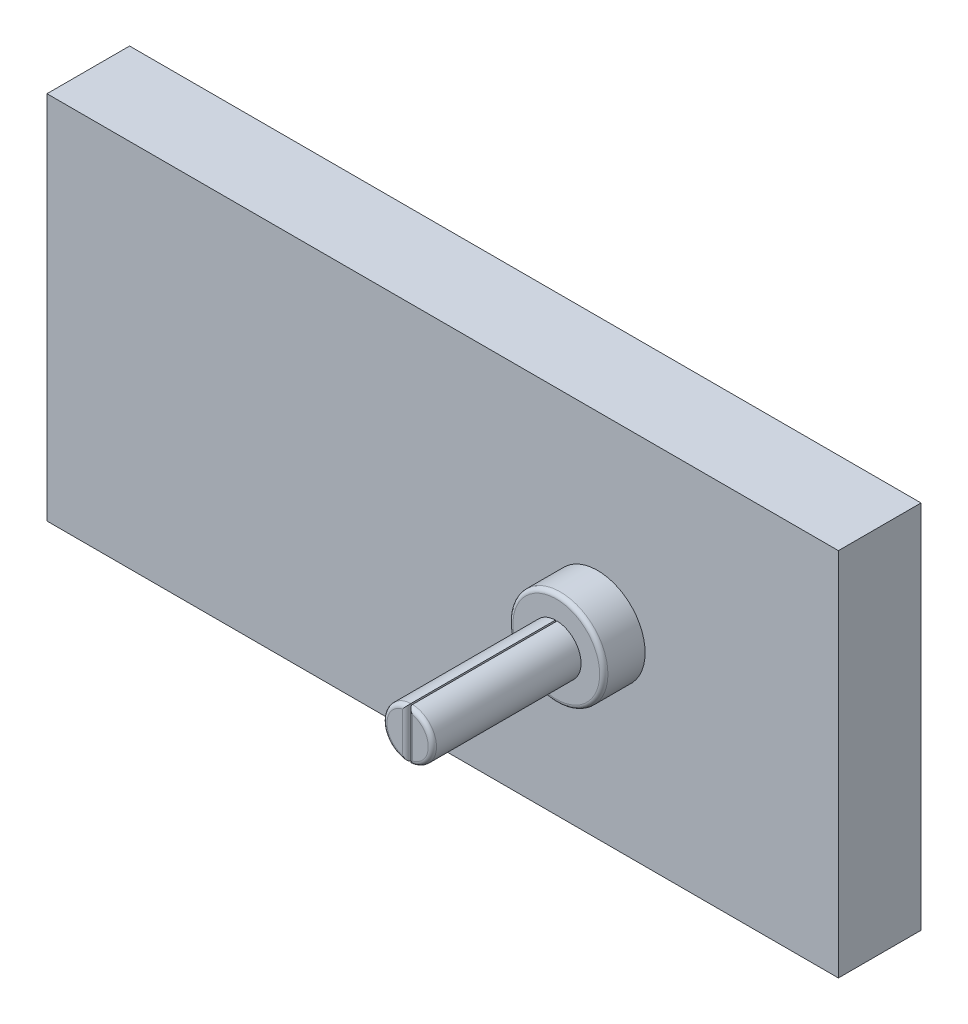
ISO-10303-21;
HEADER;
FILE_DESCRIPTION(('STEP AP214'),'2;1');
FILE_NAME('part.step','',(''),(''),'','','');
FILE_SCHEMA(('AUTOMOTIVE_DESIGN { 1 0 10303 214 1 1 1 1 }'));
ENDSEC;
DATA;
#1=APPLICATION_CONTEXT('core data for automotive mechanical design processes');
#2=APPLICATION_PROTOCOL_DEFINITION('international standard','automotive_design',2000,#1);
#3=PRODUCT_CONTEXT('',#1,'mechanical');
#4=PRODUCT('Part','Part','',(#3));
#5=PRODUCT_RELATED_PRODUCT_CATEGORY('part','',(#4));
#6=PRODUCT_DEFINITION_FORMATION('','',#4);
#7=PRODUCT_DEFINITION_CONTEXT('part definition',#1,'design');
#8=PRODUCT_DEFINITION('design','',#6,#7);
#9=PRODUCT_DEFINITION_SHAPE('','',#8);
#10=(LENGTH_UNIT() NAMED_UNIT(*) SI_UNIT(.MILLI.,.METRE.));
#11=(NAMED_UNIT(*) PLANE_ANGLE_UNIT() SI_UNIT($,.RADIAN.));
#12=(NAMED_UNIT(*) SI_UNIT($,.STERADIAN.) SOLID_ANGLE_UNIT());
#13=UNCERTAINTY_MEASURE_WITH_UNIT(LENGTH_MEASURE(1.E-05),#10,'distance_accuracy_value','');
#14=(GEOMETRIC_REPRESENTATION_CONTEXT(3) GLOBAL_UNCERTAINTY_ASSIGNED_CONTEXT((#13)) GLOBAL_UNIT_ASSIGNED_CONTEXT((#10,
#11,#12)) REPRESENTATION_CONTEXT('',''));
#15=CARTESIAN_POINT('',(0.,0.,0.));
#16=DIRECTION('',(0.,0.,1.));
#17=DIRECTION('',(1.,0.,0.));
#18=AXIS2_PLACEMENT_3D('',#15,#16,#17);
#19=CARTESIAN_POINT('',(18.75,0.,33.));
#20=DIRECTION('',(0.,0.,1.));
#21=DIRECTION('',(1.,0.,0.));
#22=AXIS2_PLACEMENT_3D('',#19,#20,#21);
#23=PLANE('',#22);
#24=DIRECTION('',(0.,-1.,0.));
#25=VECTOR('',#24,1.);
#26=CARTESIAN_POINT('',(18.15,2.99833287011299,33.));
#27=LINE('',#26,#25);
#28=CARTESIAN_POINT('',(18.15,-2.42693221990232,33.));
#29=VERTEX_POINT('',#28);
#30=CARTESIAN_POINT('',(18.15,2.42693221990232,33.));
#31=VERTEX_POINT('',#30);
#32=EDGE_CURVE('E169',#29,#31,#27,.F.);
#33=ORIENTED_EDGE('',*,*,#32,.T.);
#34=CARTESIAN_POINT('',(18.75,0.,33.));
#35=DIRECTION('',(0.,0.,1.));
#36=DIRECTION('',(1.,0.,0.));
#37=AXIS2_PLACEMENT_3D('',#34,#35,#36);
#38=CIRCLE('',#37,2.5);
#39=EDGE_CURVE('E171',#31,#29,#38,.T.);
#40=ORIENTED_EDGE('',*,*,#39,.T.);
#41=EDGE_LOOP('',(#33,#40));
#42=FACE_BOUND('',#41,.T.);
#43=ADVANCED_FACE('F39',(#42),#23,.T.);
#44=CARTESIAN_POINT('',(18.75,0.,33.));
#45=DIRECTION('',(0.,0.,-1.));
#46=DIRECTION('',(-1.,0.,0.));
#47=AXIS2_PLACEMENT_3D('',#44,#45,#46);
#48=CYLINDRICAL_SURFACE('',#47,3.);
#49=DIRECTION('',(0.,0.,-1.));
#50=VECTOR('',#49,1.);
#51=CARTESIAN_POINT('',(18.65,-2.99833287011299,33.));
#52=LINE('',#51,#50);
#53=CARTESIAN_POINT('',(18.65,-2.99833287011299,15.));
#54=VERTEX_POINT('',#53);
#55=CARTESIAN_POINT('',(18.65,-2.99833287011299,32.5));
#56=VERTEX_POINT('',#55);
#57=EDGE_CURVE('E133',#54,#56,#52,.F.);
#58=ORIENTED_EDGE('',*,*,#57,.T.);
#59=CARTESIAN_POINT('',(18.75,0.,32.5));
#60=DIRECTION('',(0.,0.,1.));
#61=DIRECTION('',(1.,0.,0.));
#62=AXIS2_PLACEMENT_3D('',#59,#60,#61);
#63=CIRCLE('',#62,3.);
#64=CARTESIAN_POINT('',(18.65,2.99833287011299,32.5));
#65=VERTEX_POINT('',#64);
#66=EDGE_CURVE('E126',#56,#65,#63,.F.);
#67=ORIENTED_EDGE('',*,*,#66,.T.);
#68=DIRECTION('',(0.,0.,-1.));
#69=VECTOR('',#68,1.);
#70=CARTESIAN_POINT('',(18.65,2.99833287011299,33.));
#71=LINE('',#70,#69);
#72=CARTESIAN_POINT('',(18.65,2.99833287011299,15.));
#73=VERTEX_POINT('',#72);
#74=EDGE_CURVE('E121',#65,#73,#71,.T.);
#75=ORIENTED_EDGE('',*,*,#74,.T.);
#76=CARTESIAN_POINT('',(18.75,0.,15.));
#77=DIRECTION('',(0.,0.,1.));
#78=DIRECTION('',(1.,0.,0.));
#79=AXIS2_PLACEMENT_3D('',#76,#77,#78);
#80=CIRCLE('',#79,3.);
#81=EDGE_CURVE('E129',#73,#54,#80,.T.);
#82=ORIENTED_EDGE('',*,*,#81,.T.);
#83=EDGE_LOOP('',(#58,#67,#75,#82));
#84=FACE_BOUND('',#83,.T.);
#85=ADVANCED_FACE('F127',(#84),#48,.T.);
#86=CARTESIAN_POINT('',(-47.9,-22.4,10.));
#87=DIRECTION('',(1.,0.,0.));
#88=DIRECTION('',(0.,0.,-1.));
#89=AXIS2_PLACEMENT_3D('',#86,#87,#88);
#90=PLANE('',#89);
#91=DIRECTION('',(0.,-1.,0.));
#92=VECTOR('',#91,1.);
#93=CARTESIAN_POINT('',(-47.9,-22.4,0.));
#94=LINE('',#93,#92);
#95=CARTESIAN_POINT('',(-47.9,22.4,0.));
#96=VERTEX_POINT('',#95);
#97=CARTESIAN_POINT('',(-47.9,-22.4,0.));
#98=VERTEX_POINT('',#97);
#99=EDGE_CURVE('E145',#96,#98,#94,.T.);
#100=ORIENTED_EDGE('',*,*,#99,.T.);
#101=DIRECTION('',(0.,0.,-1.));
#102=VECTOR('',#101,1.);
#103=CARTESIAN_POINT('',(-47.9,-22.4,10.));
#104=LINE('',#103,#102);
#105=CARTESIAN_POINT('',(-47.9,-22.4,10.));
#106=VERTEX_POINT('',#105);
#107=EDGE_CURVE('E155',#106,#98,#104,.T.);
#108=ORIENTED_EDGE('',*,*,#107,.F.);
#109=DIRECTION('',(0.,-1.,0.));
#110=VECTOR('',#109,1.);
#111=CARTESIAN_POINT('',(-47.9,-22.4,10.));
#112=LINE('',#111,#110);
#113=CARTESIAN_POINT('',(-47.9,22.4,10.));
#114=VERTEX_POINT('',#113);
#115=EDGE_CURVE('E252',#114,#106,#112,.T.);
#116=ORIENTED_EDGE('',*,*,#115,.F.);
#117=DIRECTION('',(0.,0.,-1.));
#118=VECTOR('',#117,1.);
#119=CARTESIAN_POINT('',(-47.9,22.4,10.));
#120=LINE('',#119,#118);
#121=EDGE_CURVE('E258',#114,#96,#120,.T.);
#122=ORIENTED_EDGE('',*,*,#121,.T.);
#123=EDGE_LOOP('',(#100,#108,#116,#122));
#124=FACE_BOUND('',#123,.T.);
#125=ADVANCED_FACE('F224',(#124),#90,.F.);
#126=CARTESIAN_POINT('',(47.9,-22.4,10.));
#127=DIRECTION('',(0.,1.,0.));
#128=DIRECTION('',(-1.,0.,0.));
#129=AXIS2_PLACEMENT_3D('',#126,#127,#128);
#130=PLANE('',#129);
#131=DIRECTION('',(1.,0.,0.));
#132=VECTOR('',#131,1.);
#133=CARTESIAN_POINT('',(47.9,-22.4,0.));
#134=LINE('',#133,#132);
#135=CARTESIAN_POINT('',(47.9,-22.4,0.));
#136=VERTEX_POINT('',#135);
#137=EDGE_CURVE('E147',#98,#136,#134,.T.);
#138=ORIENTED_EDGE('',*,*,#137,.T.);
#139=DIRECTION('',(0.,0.,-1.));
#140=VECTOR('',#139,1.);
#141=CARTESIAN_POINT('',(47.9,-22.4,10.));
#142=LINE('',#141,#140);
#143=CARTESIAN_POINT('',(47.9,-22.4,10.));
#144=VERTEX_POINT('',#143);
#145=EDGE_CURVE('E267',#144,#136,#142,.T.);
#146=ORIENTED_EDGE('',*,*,#145,.F.);
#147=DIRECTION('',(1.,0.,0.));
#148=VECTOR('',#147,1.);
#149=CARTESIAN_POINT('',(47.9,-22.4,10.));
#150=LINE('',#149,#148);
#151=EDGE_CURVE('E251',#106,#144,#150,.T.);
#152=ORIENTED_EDGE('',*,*,#151,.F.);
#153=ORIENTED_EDGE('',*,*,#107,.T.);
#154=EDGE_LOOP('',(#138,#146,#152,#153));
#155=FACE_BOUND('',#154,.T.);
#156=ADVANCED_FACE('F276',(#155),#130,.F.);
#157=CARTESIAN_POINT('',(47.9,-22.4,10.));
#158=DIRECTION('',(-1.,0.,0.));
#159=DIRECTION('',(0.,0.,1.));
#160=AXIS2_PLACEMENT_3D('',#157,#158,#159);
#161=PLANE('',#160);
#162=DIRECTION('',(0.,1.,0.));
#163=VECTOR('',#162,1.);
#164=CARTESIAN_POINT('',(47.9,-22.4,0.));
#165=LINE('',#164,#163);
#166=CARTESIAN_POINT('',(47.9,22.4,0.));
#167=VERTEX_POINT('',#166);
#168=EDGE_CURVE('E261',#136,#167,#165,.T.);
#169=ORIENTED_EDGE('',*,*,#168,.T.);
#170=DIRECTION('',(0.,0.,-1.));
#171=VECTOR('',#170,1.);
#172=CARTESIAN_POINT('',(47.9,22.4,10.));
#173=LINE('',#172,#171);
#174=CARTESIAN_POINT('',(47.9,22.4,10.));
#175=VERTEX_POINT('',#174);
#176=EDGE_CURVE('E270',#175,#167,#173,.T.);
#177=ORIENTED_EDGE('',*,*,#176,.F.);
#178=DIRECTION('',(0.,1.,0.));
#179=VECTOR('',#178,1.);
#180=CARTESIAN_POINT('',(47.9,-22.4,10.));
#181=LINE('',#180,#179);
#182=EDGE_CURVE('E260',#144,#175,#181,.T.);
#183=ORIENTED_EDGE('',*,*,#182,.F.);
#184=ORIENTED_EDGE('',*,*,#145,.T.);
#185=EDGE_LOOP('',(#169,#177,#183,#184));
#186=FACE_BOUND('',#185,.T.);
#187=ADVANCED_FACE('F290',(#186),#161,.F.);
#188=CARTESIAN_POINT('',(47.9,22.4,10.));
#189=DIRECTION('',(0.,-1.,0.));
#190=DIRECTION('',(1.,0.,0.));
#191=AXIS2_PLACEMENT_3D('',#188,#189,#190);
#192=PLANE('',#191);
#193=DIRECTION('',(-1.,0.,0.));
#194=VECTOR('',#193,1.);
#195=CARTESIAN_POINT('',(47.9,22.4,0.));
#196=LINE('',#195,#194);
#197=EDGE_CURVE('E253',#167,#96,#196,.T.);
#198=ORIENTED_EDGE('',*,*,#197,.T.);
#199=ORIENTED_EDGE('',*,*,#121,.F.);
#200=DIRECTION('',(-1.,0.,0.));
#201=VECTOR('',#200,1.);
#202=CARTESIAN_POINT('',(47.9,22.4,10.));
#203=LINE('',#202,#201);
#204=EDGE_CURVE('E256',#175,#114,#203,.T.);
#205=ORIENTED_EDGE('',*,*,#204,.F.);
#206=ORIENTED_EDGE('',*,*,#176,.T.);
#207=EDGE_LOOP('',(#198,#199,#205,#206));
#208=FACE_BOUND('',#207,.T.);
#209=ADVANCED_FACE('F293',(#208),#192,.F.);
#210=CARTESIAN_POINT('',(0.,0.,10.));
#211=DIRECTION('',(0.,0.,1.));
#212=DIRECTION('',(1.,0.,0.));
#213=AXIS2_PLACEMENT_3D('',#210,#211,#212);
#214=PLANE('',#213);
#215=CARTESIAN_POINT('',(18.75,0.,10.));
#216=DIRECTION('',(0.,0.,1.));
#217=DIRECTION('',(1.,0.,0.));
#218=AXIS2_PLACEMENT_3D('',#215,#216,#217);
#219=CIRCLE('',#218,5.75);
#220=CARTESIAN_POINT('',(24.5,0.,10.));
#221=VERTEX_POINT('',#220);
#222=EDGE_CURVE('E146',#221,#221,#219,.T.);
#223=ORIENTED_EDGE('',*,*,#222,.F.);
#224=EDGE_LOOP('',(#223));
#225=FACE_BOUND('',#224,.T.);
#226=ORIENTED_EDGE('',*,*,#115,.T.);
#227=ORIENTED_EDGE('',*,*,#151,.T.);
#228=ORIENTED_EDGE('',*,*,#182,.T.);
#229=ORIENTED_EDGE('',*,*,#204,.T.);
#230=EDGE_LOOP('',(#226,#227,#228,#229));
#231=FACE_BOUND('',#230,.T.);
#232=ADVANCED_FACE('F291',(#225,#231),#214,.T.);
#233=CARTESIAN_POINT('',(0.,0.,0.));
#234=DIRECTION('',(0.,0.,1.));
#235=DIRECTION('',(1.,0.,0.));
#236=AXIS2_PLACEMENT_3D('',#233,#234,#235);
#237=PLANE('',#236);
#238=ORIENTED_EDGE('',*,*,#99,.F.);
#239=ORIENTED_EDGE('',*,*,#197,.F.);
#240=ORIENTED_EDGE('',*,*,#168,.F.);
#241=ORIENTED_EDGE('',*,*,#137,.F.);
#242=EDGE_LOOP('',(#238,#239,#240,#241));
#243=FACE_BOUND('',#242,.T.);
#244=ADVANCED_FACE('F289',(#243),#237,.F.);
#245=CARTESIAN_POINT('',(18.75,0.,15.));
#246=DIRECTION('',(0.,0.,-1.));
#247=DIRECTION('',(-1.,0.,0.));
#248=AXIS2_PLACEMENT_3D('',#245,#246,#247);
#249=CYLINDRICAL_SURFACE('',#248,5.75);
#250=CARTESIAN_POINT('',(18.75,0.,14.5));
#251=DIRECTION('',(0.,0.,1.));
#252=DIRECTION('',(1.,0.,0.));
#253=AXIS2_PLACEMENT_3D('',#250,#251,#252);
#254=CIRCLE('',#253,5.75);
#255=CARTESIAN_POINT('',(24.5,0.,14.5));
#256=VERTEX_POINT('',#255);
#257=EDGE_CURVE('E11',#256,#256,#254,.F.);
#258=ORIENTED_EDGE('',*,*,#257,.T.);
#259=EDGE_LOOP('',(#258));
#260=FACE_BOUND('',#259,.T.);
#261=ORIENTED_EDGE('',*,*,#222,.T.);
#262=EDGE_LOOP('',(#261));
#263=FACE_BOUND('',#262,.T.);
#264=ADVANCED_FACE('F235',(#260,#263),#249,.T.);
#265=CARTESIAN_POINT('',(18.75,0.,15.));
#266=DIRECTION('',(0.,0.,1.));
#267=DIRECTION('',(1.,0.,0.));
#268=AXIS2_PLACEMENT_3D('',#265,#266,#267);
#269=PLANE('',#268);
#270=CARTESIAN_POINT('',(18.75,0.,15.));
#271=DIRECTION('',(0.,0.,1.));
#272=DIRECTION('',(1.,0.,0.));
#273=AXIS2_PLACEMENT_3D('',#270,#271,#272);
#274=CIRCLE('',#273,5.25);
#275=CARTESIAN_POINT('',(24.,0.,15.));
#276=VERTEX_POINT('',#275);
#277=EDGE_CURVE('E52',#276,#276,#274,.T.);
#278=ORIENTED_EDGE('',*,*,#277,.T.);
#279=EDGE_LOOP('',(#278));
#280=FACE_BOUND('',#279,.T.);
#281=ORIENTED_EDGE('',*,*,#81,.F.);
#282=DIRECTION('',(0.,-1.,0.));
#283=VECTOR('',#282,1.);
#284=CARTESIAN_POINT('',(18.65,-9.99999999999988,15.));
#285=LINE('',#284,#283);
#286=EDGE_CURVE('E134',#73,#54,#285,.T.);
#287=ORIENTED_EDGE('',*,*,#286,.T.);
#288=EDGE_LOOP('',(#281,#287));
#289=FACE_BOUND('',#288,.T.);
#290=DIRECTION('',(0.,1.,0.));
#291=VECTOR('',#290,1.);
#292=CARTESIAN_POINT('',(18.85,-9.99999999999988,15.));
#293=LINE('',#292,#291);
#294=CARTESIAN_POINT('',(18.85,-2.99833287011299,15.));
#295=VERTEX_POINT('',#294);
#296=CARTESIAN_POINT('',(18.85,2.99833287011299,15.));
#297=VERTEX_POINT('',#296);
#298=EDGE_CURVE('E136',#295,#297,#293,.T.);
#299=ORIENTED_EDGE('',*,*,#298,.T.);
#300=EDGE_CURVE('E141',#295,#297,#80,.T.);
#301=ORIENTED_EDGE('',*,*,#300,.F.);
#302=EDGE_LOOP('',(#299,#301));
#303=FACE_BOUND('',#302,.T.);
#304=ADVANCED_FACE('F137',(#280,#289,#303),#269,.T.);
#305=DIRECTION('',(0.,1.,0.));
#306=VECTOR('',#305,1.);
#307=CARTESIAN_POINT('',(19.35,-2.99833287011299,33.));
#308=LINE('',#307,#306);
#309=CARTESIAN_POINT('',(19.35,2.42693221990232,33.));
#310=VERTEX_POINT('',#309);
#311=CARTESIAN_POINT('',(19.35,-2.42693221990232,33.));
#312=VERTEX_POINT('',#311);
#313=EDGE_CURVE('E128',#310,#312,#308,.F.);
#314=ORIENTED_EDGE('',*,*,#313,.T.);
#315=CARTESIAN_POINT('',(18.75,0.,33.));
#316=DIRECTION('',(0.,0.,1.));
#317=DIRECTION('',(1.,0.,0.));
#318=AXIS2_PLACEMENT_3D('',#315,#316,#317);
#319=CIRCLE('',#318,2.5);
#320=EDGE_CURVE('E163',#312,#310,#319,.T.);
#321=ORIENTED_EDGE('',*,*,#320,.T.);
#322=EDGE_LOOP('',(#314,#321));
#323=FACE_BOUND('',#322,.T.);
#324=ADVANCED_FACE('F218',(#323),#23,.T.);
#325=DIRECTION('',(0.,0.,-1.));
#326=VECTOR('',#325,1.);
#327=CARTESIAN_POINT('',(18.85,2.99833287011299,33.));
#328=LINE('',#327,#326);
#329=CARTESIAN_POINT('',(18.85,2.99833287011299,32.5));
#330=VERTEX_POINT('',#329);
#331=EDGE_CURVE('E154',#297,#330,#328,.F.);
#332=ORIENTED_EDGE('',*,*,#331,.T.);
#333=CARTESIAN_POINT('',(18.75,0.,32.5));
#334=DIRECTION('',(0.,0.,1.));
#335=DIRECTION('',(1.,0.,0.));
#336=AXIS2_PLACEMENT_3D('',#333,#334,#335);
#337=CIRCLE('',#336,3.);
#338=CARTESIAN_POINT('',(18.85,-2.99833287011299,32.5));
#339=VERTEX_POINT('',#338);
#340=EDGE_CURVE('E165',#330,#339,#337,.F.);
#341=ORIENTED_EDGE('',*,*,#340,.T.);
#342=DIRECTION('',(0.,0.,-1.));
#343=VECTOR('',#342,1.);
#344=CARTESIAN_POINT('',(18.85,-2.99833287011299,33.));
#345=LINE('',#344,#343);
#346=EDGE_CURVE('E156',#339,#295,#345,.T.);
#347=ORIENTED_EDGE('',*,*,#346,.T.);
#348=ORIENTED_EDGE('',*,*,#300,.T.);
#349=EDGE_LOOP('',(#332,#341,#347,#348));
#350=FACE_BOUND('',#349,.T.);
#351=ADVANCED_FACE('F225',(#350),#48,.T.);
#352=CARTESIAN_POINT('',(18.65,-9.99999999999988,15.));
#353=DIRECTION('',(-1.,0.,0.));
#354=DIRECTION('',(0.,0.,1.));
#355=AXIS2_PLACEMENT_3D('',#352,#353,#354);
#356=PLANE('',#355);
#357=ORIENTED_EDGE('',*,*,#74,.F.);
#358=DIRECTION('',(0.,-1.,0.));
#359=VECTOR('',#358,1.);
#360=CARTESIAN_POINT('',(18.65,-2.99833287011299,32.5));
#361=LINE('',#360,#359);
#362=EDGE_CURVE('E62',#65,#56,#361,.T.);
#363=ORIENTED_EDGE('',*,*,#362,.T.);
#364=ORIENTED_EDGE('',*,*,#57,.F.);
#365=ORIENTED_EDGE('',*,*,#286,.F.);
#366=EDGE_LOOP('',(#357,#363,#364,#365));
#367=FACE_BOUND('',#366,.T.);
#368=ADVANCED_FACE('F132',(#367),#356,.F.);
#369=CARTESIAN_POINT('',(18.85,-9.99999999999988,15.));
#370=DIRECTION('',(1.,0.,0.));
#371=DIRECTION('',(0.,0.,-1.));
#372=AXIS2_PLACEMENT_3D('',#369,#370,#371);
#373=PLANE('',#372);
#374=ORIENTED_EDGE('',*,*,#346,.F.);
#375=DIRECTION('',(0.,1.,0.));
#376=VECTOR('',#375,1.);
#377=CARTESIAN_POINT('',(18.85,2.99833287011299,32.5));
#378=LINE('',#377,#376);
#379=EDGE_CURVE('E170',#339,#330,#378,.T.);
#380=ORIENTED_EDGE('',*,*,#379,.T.);
#381=ORIENTED_EDGE('',*,*,#331,.F.);
#382=ORIENTED_EDGE('',*,*,#298,.F.);
#383=EDGE_LOOP('',(#374,#380,#381,#382));
#384=FACE_BOUND('',#383,.T.);
#385=ADVANCED_FACE('F198',(#384),#373,.F.);
#386=CARTESIAN_POINT('',(19.35,-9.99999999999988,32.5));
#387=DIRECTION('',(0.,-1.,0.));
#388=DIRECTION('',(0.,0.,-1.));
#389=AXIS2_PLACEMENT_3D('',#386,#387,#388);
#390=CYLINDRICAL_SURFACE('',#389,0.5);
#391=CARTESIAN_POINT('',(18.85,2.99833287011299,32.5));
#392=CARTESIAN_POINT('',(18.8499620561114,2.99836816911777,32.5220575874066));
#393=CARTESIAN_POINT('',(18.8514570214935,2.99682654063242,32.5440612569383));
#394=CARTESIAN_POINT('',(18.8571857212144,2.99089672354247,32.5871294540699));
#395=CARTESIAN_POINT('',(18.8613959726509,2.98653294118215,32.6082003940781));
#396=CARTESIAN_POINT('',(18.8722239053222,2.97527161155762,32.6489171732963));
#397=CARTESIAN_POINT('',(18.8788352945971,2.96838068598135,32.668566577593));
#398=CARTESIAN_POINT('',(18.8940400933025,2.95245922002746,32.706186614413));
#399=CARTESIAN_POINT('',(18.9026378076498,2.94342403126159,32.7241534797985));
#400=CARTESIAN_POINT('',(18.9251465408922,2.91963735590255,32.7650301367615));
#401=CARTESIAN_POINT('',(18.9398064655602,2.90404573582878,32.7870376975869));
#402=CARTESIAN_POINT('',(18.9711825008829,2.87035785475719,32.8273413364828));
#403=CARTESIAN_POINT('',(18.9879023764986,2.85225699985798,32.8456304517863));
#404=CARTESIAN_POINT('',(19.0302467344139,2.80592443940005,32.8859360638096));
#405=CARTESIAN_POINT('',(19.0565712281533,2.77672058379902,32.9060923728663));
#406=CARTESIAN_POINT('',(19.1104599001379,2.71589391687965,32.9400424795981));
#407=CARTESIAN_POINT('',(19.1380261882023,2.68426691944134,32.9538249634243));
#408=CARTESIAN_POINT('',(19.1961146864802,2.61636158208021,32.9768495505572));
#409=CARTESIAN_POINT('',(19.2266691388812,2.57992667026787,32.9855366070834));
#410=CARTESIAN_POINT('',(19.2873675404552,2.50593069939455,32.9970200824882));
#411=CARTESIAN_POINT('',(19.3175120826412,2.46837159311267,32.9998261758293));
#412=CARTESIAN_POINT('',(19.3481342680848,2.42931450730961,32.999997383405));
#413=CARTESIAN_POINT('',(19.3490673637264,2.42812351110288,32.999999992398));
#414=CARTESIAN_POINT('',(19.35,2.42693221990232,33.));
#415=B_SPLINE_CURVE_WITH_KNOTS('',3,(#391,#392,#393,#394,#395,#396,#397,#398,#399,#400,#401,
#402,#403,#404,#405,#406,#407,#408,#409,#410,#411,#412,#413,#414),.UNSPECIFIED.,.F.,.F.,(4,2,2,
2,2,2,2,2,2,2,2,4),(0.,0.0659829703992642,0.131402809406744,0.196652444236481,0.262044842183482,
0.353626777800389,0.445378651941674,0.577199130134487,0.709252706346296,0.853838895487651,
0.998187046211559,1.00272601141497),.UNSPECIFIED.);
#416=EDGE_CURVE('E178',#330,#310,#415,.T.);
#417=ORIENTED_EDGE('',*,*,#416,.F.);
#418=ORIENTED_EDGE('',*,*,#379,.F.);
#419=CARTESIAN_POINT('',(18.85,-2.99833287011299,32.5));
#420=CARTESIAN_POINT('',(18.8499620561114,-2.99836816911777,32.5220575874066));
#421=CARTESIAN_POINT('',(18.8514570214935,-2.99682654063242,32.5440612569383));
#422=CARTESIAN_POINT('',(18.8571857212144,-2.99089672354247,32.5871294540699));
#423=CARTESIAN_POINT('',(18.8613959726509,-2.98653294118215,32.6082003940781));
#424=CARTESIAN_POINT('',(18.8722239053222,-2.97527161155762,32.6489171732963));
#425=CARTESIAN_POINT('',(18.8788352945971,-2.96838068598135,32.668566577593));
#426=CARTESIAN_POINT('',(18.8940400933025,-2.95245922002746,32.706186614413));
#427=CARTESIAN_POINT('',(18.9026378076498,-2.94342403126159,32.7241534797985));
#428=CARTESIAN_POINT('',(18.9251465408922,-2.91963735590255,32.7650301367615));
#429=CARTESIAN_POINT('',(18.9398064655602,-2.90404573582878,32.7870376975869));
#430=CARTESIAN_POINT('',(18.9711825008829,-2.87035785475719,32.8273413364828));
#431=CARTESIAN_POINT('',(18.9879023764986,-2.85225699985798,32.8456304517863));
#432=CARTESIAN_POINT('',(19.0302467344139,-2.80592443940005,32.8859360638096));
#433=CARTESIAN_POINT('',(19.0565712281533,-2.77672058379902,32.9060923728663));
#434=CARTESIAN_POINT('',(19.1104599001379,-2.71589391687965,32.9400424795981));
#435=CARTESIAN_POINT('',(19.1380261882023,-2.68426691944134,32.9538249634243));
#436=CARTESIAN_POINT('',(19.1961146864802,-2.61636158208021,32.9768495505572));
#437=CARTESIAN_POINT('',(19.2266691388812,-2.57992667026787,32.9855366070834));
#438=CARTESIAN_POINT('',(19.2873675404552,-2.50593069939455,32.9970200824882));
#439=CARTESIAN_POINT('',(19.3175120826412,-2.46837159311267,32.9998261758293));
#440=CARTESIAN_POINT('',(19.3481342680848,-2.42931450730961,32.999997383405));
#441=CARTESIAN_POINT('',(19.3490673637264,-2.42812351110288,32.999999992398));
#442=CARTESIAN_POINT('',(19.35,-2.42693221990232,33.));
#443=B_SPLINE_CURVE_WITH_KNOTS('',3,(#419,#420,#421,#422,#423,#424,#425,#426,#427,#428,#429,
#430,#431,#432,#433,#434,#435,#436,#437,#438,#439,#440,#441,#442),.UNSPECIFIED.,.F.,.F.,(4,2,2,
2,2,2,2,2,2,2,2,4),(0.,0.0659829703992642,0.131402809406744,0.196652444236481,0.262044842183482,
0.353626777800389,0.445378651941674,0.577199130134487,0.709252706346296,0.853838895487651,
0.998187046211559,1.00272601141497),.UNSPECIFIED.);
#444=EDGE_CURVE('E140',#312,#339,#443,.F.);
#445=ORIENTED_EDGE('',*,*,#444,.F.);
#446=ORIENTED_EDGE('',*,*,#313,.F.);
#447=EDGE_LOOP('',(#417,#418,#445,#446));
#448=FACE_BOUND('',#447,.T.);
#449=ADVANCED_FACE('F194',(#448),#390,.T.);
#450=CARTESIAN_POINT('',(18.75,0.,32.5));
#451=DIRECTION('',(0.,0.,1.));
#452=DIRECTION('',(1.,0.,0.));
#453=AXIS2_PLACEMENT_3D('',#450,#451,#452);
#454=TOROIDAL_SURFACE('',#453,2.5,0.5);
#455=ORIENTED_EDGE('',*,*,#444,.T.);
#456=ORIENTED_EDGE('',*,*,#340,.F.);
#457=ORIENTED_EDGE('',*,*,#416,.T.);
#458=ORIENTED_EDGE('',*,*,#320,.F.);
#459=EDGE_LOOP('',(#455,#456,#457,#458));
#460=FACE_BOUND('',#459,.T.);
#461=ADVANCED_FACE('F188',(#460),#454,.T.);
#462=CARTESIAN_POINT('',(18.15,-9.99999999999988,32.5));
#463=DIRECTION('',(0.,1.,0.));
#464=DIRECTION('',(0.,0.,1.));
#465=AXIS2_PLACEMENT_3D('',#462,#463,#464);
#466=CYLINDRICAL_SURFACE('',#465,0.5);
#467=CARTESIAN_POINT('',(18.65,-2.99833287011299,32.5));
#468=CARTESIAN_POINT('',(18.6500379438886,-2.99836816911777,32.5220575874066));
#469=CARTESIAN_POINT('',(18.6485429785065,-2.99682654063241,32.5440612569383));
#470=CARTESIAN_POINT('',(18.6428142787856,-2.99089672354247,32.5871294540699));
#471=CARTESIAN_POINT('',(18.6386040273491,-2.98653294118215,32.6082003940781));
#472=CARTESIAN_POINT('',(18.6277760946778,-2.97527161155762,32.6489171732963));
#473=CARTESIAN_POINT('',(18.6211647054029,-2.96838068598134,32.668566577593));
#474=CARTESIAN_POINT('',(18.6059599066975,-2.95245922002746,32.706186614413));
#475=CARTESIAN_POINT('',(18.5973621923502,-2.94342403126159,32.7241534797985));
#476=CARTESIAN_POINT('',(18.5748534591078,-2.91963735590255,32.7650301367615));
#477=CARTESIAN_POINT('',(18.5601935344398,-2.90404573582878,32.7870376975869));
#478=CARTESIAN_POINT('',(18.5288174991171,-2.87035785475719,32.8273413364828));
#479=CARTESIAN_POINT('',(18.5120976235014,-2.85225699985798,32.8456304517863));
#480=CARTESIAN_POINT('',(18.4697532655861,-2.80592443940005,32.8859360638096));
#481=CARTESIAN_POINT('',(18.4434287718467,-2.77672058379902,32.9060923728663));
#482=CARTESIAN_POINT('',(18.3895400998621,-2.71589391687965,32.9400424795981));
#483=CARTESIAN_POINT('',(18.3619738117977,-2.68426691944133,32.9538249634243));
#484=CARTESIAN_POINT('',(18.3038853135198,-2.61636158208021,32.9768495505572));
#485=CARTESIAN_POINT('',(18.2733308611188,-2.57992667026787,32.9855366070834));
#486=CARTESIAN_POINT('',(18.2126324595448,-2.50593069939455,32.9970200824882));
#487=CARTESIAN_POINT('',(18.1824879173588,-2.46837159311267,32.9998261758293));
#488=CARTESIAN_POINT('',(18.1518657319152,-2.42931450730961,32.999997383405));
#489=CARTESIAN_POINT('',(18.1509326362736,-2.42812351110288,32.999999992398));
#490=CARTESIAN_POINT('',(18.15,-2.42693221990232,33.));
#491=B_SPLINE_CURVE_WITH_KNOTS('',3,(#467,#468,#469,#470,#471,#472,#473,#474,#475,#476,#477,
#478,#479,#480,#481,#482,#483,#484,#485,#486,#487,#488,#489,#490),.UNSPECIFIED.,.F.,.F.,(4,2,2,
2,2,2,2,2,2,2,2,4),(0.,0.0659829703992642,0.131402809406744,0.196652444236481,0.262044842183482,
0.353626777800389,0.445378651941674,0.577199130134491,0.709252706346297,0.853838895487651,
0.99818704621156,1.00272601141497),.UNSPECIFIED.);
#492=EDGE_CURVE('E202',#56,#29,#491,.T.);
#493=ORIENTED_EDGE('',*,*,#492,.F.);
#494=ORIENTED_EDGE('',*,*,#362,.F.);
#495=CARTESIAN_POINT('',(18.65,2.99833287011299,32.5));
#496=CARTESIAN_POINT('',(18.6500379438886,2.99836816911777,32.5220575874066));
#497=CARTESIAN_POINT('',(18.6485429785065,2.99682654063241,32.5440612569383));
#498=CARTESIAN_POINT('',(18.6428142787856,2.99089672354247,32.5871294540699));
#499=CARTESIAN_POINT('',(18.6386040273491,2.98653294118215,32.6082003940781));
#500=CARTESIAN_POINT('',(18.6277760946778,2.97527161155762,32.6489171732963));
#501=CARTESIAN_POINT('',(18.6211647054029,2.96838068598134,32.668566577593));
#502=CARTESIAN_POINT('',(18.6059599066975,2.95245922002746,32.706186614413));
#503=CARTESIAN_POINT('',(18.5973621923502,2.94342403126159,32.7241534797985));
#504=CARTESIAN_POINT('',(18.5748534591078,2.91963735590255,32.7650301367615));
#505=CARTESIAN_POINT('',(18.5601935344398,2.90404573582878,32.7870376975869));
#506=CARTESIAN_POINT('',(18.5288174991171,2.87035785475719,32.8273413364828));
#507=CARTESIAN_POINT('',(18.5120976235014,2.85225699985798,32.8456304517863));
#508=CARTESIAN_POINT('',(18.4697532655861,2.80592443940005,32.8859360638096));
#509=CARTESIAN_POINT('',(18.4434287718467,2.77672058379902,32.9060923728663));
#510=CARTESIAN_POINT('',(18.3895400998621,2.71589391687965,32.9400424795981));
#511=CARTESIAN_POINT('',(18.3619738117977,2.68426691944133,32.9538249634243));
#512=CARTESIAN_POINT('',(18.3038853135198,2.61636158208021,32.9768495505572));
#513=CARTESIAN_POINT('',(18.2733308611188,2.57992667026787,32.9855366070834));
#514=CARTESIAN_POINT('',(18.2126324595448,2.50593069939455,32.9970200824882));
#515=CARTESIAN_POINT('',(18.1824879173588,2.46837159311267,32.9998261758293));
#516=CARTESIAN_POINT('',(18.1518657319152,2.42931450730961,32.999997383405));
#517=CARTESIAN_POINT('',(18.1509326362736,2.42812351110288,32.999999992398));
#518=CARTESIAN_POINT('',(18.15,2.42693221990232,33.));
#519=B_SPLINE_CURVE_WITH_KNOTS('',3,(#495,#496,#497,#498,#499,#500,#501,#502,#503,#504,#505,
#506,#507,#508,#509,#510,#511,#512,#513,#514,#515,#516,#517,#518),.UNSPECIFIED.,.F.,.F.,(4,2,2,
2,2,2,2,2,2,2,2,4),(0.,0.0659829703992642,0.131402809406744,0.196652444236481,0.262044842183482,
0.353626777800389,0.445378651941674,0.577199130134491,0.709252706346297,0.853838895487651,
0.99818704621156,1.00272601141497),.UNSPECIFIED.);
#520=EDGE_CURVE('E43',#31,#65,#519,.F.);
#521=ORIENTED_EDGE('',*,*,#520,.F.);
#522=ORIENTED_EDGE('',*,*,#32,.F.);
#523=EDGE_LOOP('',(#493,#494,#521,#522));
#524=FACE_BOUND('',#523,.T.);
#525=ADVANCED_FACE('F201',(#524),#466,.T.);
#526=CARTESIAN_POINT('',(18.75,0.,32.5));
#527=DIRECTION('',(0.,0.,1.));
#528=DIRECTION('',(1.,0.,0.));
#529=AXIS2_PLACEMENT_3D('',#526,#527,#528);
#530=TOROIDAL_SURFACE('',#529,2.5,0.5);
#531=ORIENTED_EDGE('',*,*,#520,.T.);
#532=ORIENTED_EDGE('',*,*,#66,.F.);
#533=ORIENTED_EDGE('',*,*,#492,.T.);
#534=ORIENTED_EDGE('',*,*,#39,.F.);
#535=EDGE_LOOP('',(#531,#532,#533,#534));
#536=FACE_BOUND('',#535,.T.);
#537=ADVANCED_FACE('F196',(#536),#530,.T.);
#538=CARTESIAN_POINT('',(18.75,0.,14.5));
#539=DIRECTION('',(0.,0.,1.));
#540=DIRECTION('',(1.,0.,0.));
#541=AXIS2_PLACEMENT_3D('',#538,#539,#540);
#542=TOROIDAL_SURFACE('',#541,5.25,0.5);
#543=ORIENTED_EDGE('',*,*,#257,.F.);
#544=EDGE_LOOP('',(#543));
#545=FACE_BOUND('',#544,.T.);
#546=ORIENTED_EDGE('',*,*,#277,.F.);
#547=EDGE_LOOP('',(#546));
#548=FACE_BOUND('',#547,.T.);
#549=ADVANCED_FACE('F41',(#545,#548),#542,.T.);
#550=CLOSED_SHELL('',(#43,#85,#125,#156,#187,#209,#232,#244,#264,#304,#324,#351,#368,#385,#449,
#461,#525,#537,#549));
#551=MANIFOLD_SOLID_BREP('B2',#550);
#552=ADVANCED_BREP_SHAPE_REPRESENTATION('',(#18,#551),#14);
#553=SHAPE_DEFINITION_REPRESENTATION(#9,#552);
ENDSEC;
END-ISO-10303-21;
